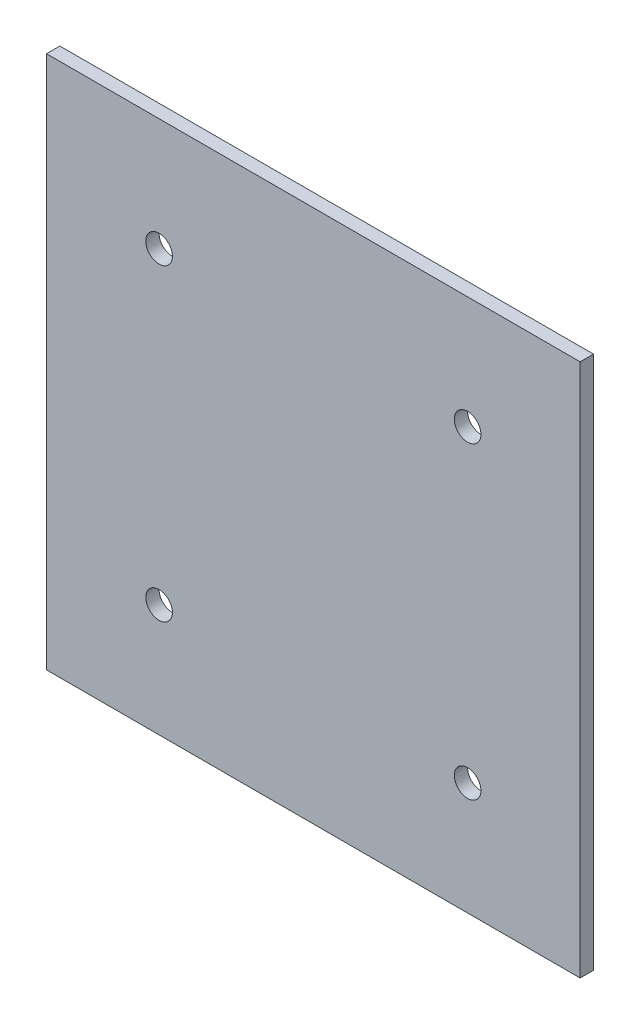
ISO-10303-21;
HEADER;
FILE_DESCRIPTION(('STEP AP214'),'2;1');
FILE_NAME('part.step','',(''),(''),'','','');
FILE_SCHEMA(('AUTOMOTIVE_DESIGN { 1 0 10303 214 1 1 1 1 }'));
ENDSEC;
DATA;
#1=APPLICATION_CONTEXT('core data for automotive mechanical design processes');
#2=APPLICATION_PROTOCOL_DEFINITION('international standard','automotive_design',2000,#1);
#3=PRODUCT_CONTEXT('',#1,'mechanical');
#4=PRODUCT('Part','Part','',(#3));
#5=PRODUCT_RELATED_PRODUCT_CATEGORY('part','',(#4));
#6=PRODUCT_DEFINITION_FORMATION('','',#4);
#7=PRODUCT_DEFINITION_CONTEXT('part definition',#1,'design');
#8=PRODUCT_DEFINITION('design','',#6,#7);
#9=PRODUCT_DEFINITION_SHAPE('','',#8);
#10=(LENGTH_UNIT() NAMED_UNIT(*) SI_UNIT(.MILLI.,.METRE.));
#11=(NAMED_UNIT(*) PLANE_ANGLE_UNIT() SI_UNIT($,.RADIAN.));
#12=(NAMED_UNIT(*) SI_UNIT($,.STERADIAN.) SOLID_ANGLE_UNIT());
#13=UNCERTAINTY_MEASURE_WITH_UNIT(LENGTH_MEASURE(1.E-05),#10,'distance_accuracy_value','');
#14=(GEOMETRIC_REPRESENTATION_CONTEXT(3) GLOBAL_UNCERTAINTY_ASSIGNED_CONTEXT((#13)) GLOBAL_UNIT_ASSIGNED_CONTEXT((#10,
#11,#12)) REPRESENTATION_CONTEXT('',''));
#15=CARTESIAN_POINT('',(0.,0.,0.));
#16=DIRECTION('',(0.,0.,1.));
#17=DIRECTION('',(1.,0.,0.));
#18=AXIS2_PLACEMENT_3D('',#15,#16,#17);
#19=CARTESIAN_POINT('',(32.,-32.,9.6));
#20=DIRECTION('',(-1.,0.,0.));
#21=DIRECTION('',(0.,0.,1.));
#22=AXIS2_PLACEMENT_3D('',#19,#20,#21);
#23=PLANE('',#22);
#24=DIRECTION('',(0.,1.,0.));
#25=VECTOR('',#24,1.);
#26=CARTESIAN_POINT('',(32.,-32.,8.));
#27=LINE('',#26,#25);
#28=CARTESIAN_POINT('',(32.,-32.,8.));
#29=VERTEX_POINT('',#28);
#30=CARTESIAN_POINT('',(32.,32.,8.));
#31=VERTEX_POINT('',#30);
#32=EDGE_CURVE('E98',#29,#31,#27,.T.);
#33=ORIENTED_EDGE('',*,*,#32,.T.);
#34=DIRECTION('',(0.,0.,-1.));
#35=VECTOR('',#34,1.);
#36=CARTESIAN_POINT('',(32.,32.,9.6));
#37=LINE('',#36,#35);
#38=CARTESIAN_POINT('',(32.,32.,9.6));
#39=VERTEX_POINT('',#38);
#40=EDGE_CURVE('E11',#39,#31,#37,.T.);
#41=ORIENTED_EDGE('',*,*,#40,.F.);
#42=DIRECTION('',(0.,1.,0.));
#43=VECTOR('',#42,1.);
#44=CARTESIAN_POINT('',(32.,-32.,9.6));
#45=LINE('',#44,#43);
#46=CARTESIAN_POINT('',(32.,-32.,9.6));
#47=VERTEX_POINT('',#46);
#48=EDGE_CURVE('E86',#47,#39,#45,.T.);
#49=ORIENTED_EDGE('',*,*,#48,.F.);
#50=DIRECTION('',(0.,0.,-1.));
#51=VECTOR('',#50,1.);
#52=CARTESIAN_POINT('',(32.,-32.,9.6));
#53=LINE('',#52,#51);
#54=EDGE_CURVE('E94',#47,#29,#53,.T.);
#55=ORIENTED_EDGE('',*,*,#54,.T.);
#56=EDGE_LOOP('',(#33,#41,#49,#55));
#57=FACE_BOUND('',#56,.T.);
#58=ADVANCED_FACE('F35',(#57),#23,.F.);
#59=CARTESIAN_POINT('',(-32.,32.,9.6));
#60=DIRECTION('',(0.,-1.,0.));
#61=DIRECTION('',(0.,0.,-1.));
#62=AXIS2_PLACEMENT_3D('',#59,#60,#61);
#63=PLANE('',#62);
#64=DIRECTION('',(-1.,0.,0.));
#65=VECTOR('',#64,1.);
#66=CARTESIAN_POINT('',(-32.,32.,8.));
#67=LINE('',#66,#65);
#68=CARTESIAN_POINT('',(-32.,32.,8.));
#69=VERTEX_POINT('',#68);
#70=EDGE_CURVE('E90',#31,#69,#67,.T.);
#71=ORIENTED_EDGE('',*,*,#70,.T.);
#72=DIRECTION('',(0.,0.,-1.));
#73=VECTOR('',#72,1.);
#74=CARTESIAN_POINT('',(-32.,32.,9.6));
#75=LINE('',#74,#73);
#76=CARTESIAN_POINT('',(-32.,32.,9.6));
#77=VERTEX_POINT('',#76);
#78=EDGE_CURVE('E43',#77,#69,#75,.T.);
#79=ORIENTED_EDGE('',*,*,#78,.F.);
#80=DIRECTION('',(-1.,0.,0.));
#81=VECTOR('',#80,1.);
#82=CARTESIAN_POINT('',(-32.,32.,9.6));
#83=LINE('',#82,#81);
#84=EDGE_CURVE('E81',#39,#77,#83,.T.);
#85=ORIENTED_EDGE('',*,*,#84,.F.);
#86=ORIENTED_EDGE('',*,*,#40,.T.);
#87=EDGE_LOOP('',(#71,#79,#85,#86));
#88=FACE_BOUND('',#87,.T.);
#89=ADVANCED_FACE('F89',(#88),#63,.F.);
#90=CARTESIAN_POINT('',(-32.,-32.,9.6));
#91=DIRECTION('',(1.,0.,0.));
#92=DIRECTION('',(0.,0.,-1.));
#93=AXIS2_PLACEMENT_3D('',#90,#91,#92);
#94=PLANE('',#93);
#95=DIRECTION('',(0.,-1.,0.));
#96=VECTOR('',#95,1.);
#97=CARTESIAN_POINT('',(-32.,-32.,8.));
#98=LINE('',#97,#96);
#99=CARTESIAN_POINT('',(-32.,-32.,8.));
#100=VERTEX_POINT('',#99);
#101=EDGE_CURVE('E68',#69,#100,#98,.T.);
#102=ORIENTED_EDGE('',*,*,#101,.T.);
#103=DIRECTION('',(0.,0.,-1.));
#104=VECTOR('',#103,1.);
#105=CARTESIAN_POINT('',(-32.,-32.,9.6));
#106=LINE('',#105,#104);
#107=CARTESIAN_POINT('',(-32.,-32.,9.6));
#108=VERTEX_POINT('',#107);
#109=EDGE_CURVE('E91',#108,#100,#106,.T.);
#110=ORIENTED_EDGE('',*,*,#109,.F.);
#111=DIRECTION('',(0.,-1.,0.));
#112=VECTOR('',#111,1.);
#113=CARTESIAN_POINT('',(-32.,-32.,9.6));
#114=LINE('',#113,#112);
#115=EDGE_CURVE('E84',#77,#108,#114,.T.);
#116=ORIENTED_EDGE('',*,*,#115,.F.);
#117=ORIENTED_EDGE('',*,*,#78,.T.);
#118=EDGE_LOOP('',(#102,#110,#116,#117));
#119=FACE_BOUND('',#118,.T.);
#120=ADVANCED_FACE('F92',(#119),#94,.F.);
#121=CARTESIAN_POINT('',(-32.,-32.,9.6));
#122=DIRECTION('',(0.,1.,0.));
#123=DIRECTION('',(0.,0.,1.));
#124=AXIS2_PLACEMENT_3D('',#121,#122,#123);
#125=PLANE('',#124);
#126=DIRECTION('',(1.,0.,0.));
#127=VECTOR('',#126,1.);
#128=CARTESIAN_POINT('',(-32.,-32.,8.));
#129=LINE('',#128,#127);
#130=EDGE_CURVE('E74',#100,#29,#129,.T.);
#131=ORIENTED_EDGE('',*,*,#130,.T.);
#132=ORIENTED_EDGE('',*,*,#54,.F.);
#133=DIRECTION('',(1.,0.,0.));
#134=VECTOR('',#133,1.);
#135=CARTESIAN_POINT('',(-32.,-32.,9.6));
#136=LINE('',#135,#134);
#137=EDGE_CURVE('E51',#108,#47,#136,.T.);
#138=ORIENTED_EDGE('',*,*,#137,.F.);
#139=ORIENTED_EDGE('',*,*,#109,.T.);
#140=EDGE_LOOP('',(#131,#132,#138,#139));
#141=FACE_BOUND('',#140,.T.);
#142=ADVANCED_FACE('F106',(#141),#125,.F.);
#143=CARTESIAN_POINT('',(0.,0.,9.6));
#144=DIRECTION('',(0.,0.,-1.));
#145=DIRECTION('',(-1.,0.,0.));
#146=AXIS2_PLACEMENT_3D('',#143,#144,#145);
#147=PLANE('',#146);
#148=CARTESIAN_POINT('',(-18.5,18.5,9.6));
#149=DIRECTION('',(0.,0.,1.));
#150=DIRECTION('',(1.,0.,0.));
#151=AXIS2_PLACEMENT_3D('',#148,#149,#150);
#152=CIRCLE('',#151,1.6);
#153=CARTESIAN_POINT('',(-16.9,18.5,9.6));
#154=VERTEX_POINT('',#153);
#155=EDGE_CURVE('E115',#154,#154,#152,.T.);
#156=ORIENTED_EDGE('',*,*,#155,.F.);
#157=EDGE_LOOP('',(#156));
#158=FACE_BOUND('',#157,.T.);
#159=CARTESIAN_POINT('',(18.5,-18.5,9.6));
#160=DIRECTION('',(0.,0.,1.));
#161=DIRECTION('',(1.,0.,0.));
#162=AXIS2_PLACEMENT_3D('',#159,#160,#161);
#163=CIRCLE('',#162,1.6);
#164=CARTESIAN_POINT('',(20.1,-18.5,9.6));
#165=VERTEX_POINT('',#164);
#166=EDGE_CURVE('E121',#165,#165,#163,.T.);
#167=ORIENTED_EDGE('',*,*,#166,.F.);
#168=EDGE_LOOP('',(#167));
#169=FACE_BOUND('',#168,.T.);
#170=CARTESIAN_POINT('',(18.5,18.5,9.6));
#171=DIRECTION('',(0.,0.,1.));
#172=DIRECTION('',(1.,0.,0.));
#173=AXIS2_PLACEMENT_3D('',#170,#171,#172);
#174=CIRCLE('',#173,1.6);
#175=CARTESIAN_POINT('',(20.1,18.5,9.6));
#176=VERTEX_POINT('',#175);
#177=EDGE_CURVE('E122',#176,#176,#174,.T.);
#178=ORIENTED_EDGE('',*,*,#177,.F.);
#179=EDGE_LOOP('',(#178));
#180=FACE_BOUND('',#179,.T.);
#181=CARTESIAN_POINT('',(-18.5,-18.5,9.6));
#182=DIRECTION('',(0.,0.,1.));
#183=DIRECTION('',(1.,0.,0.));
#184=AXIS2_PLACEMENT_3D('',#181,#182,#183);
#185=CIRCLE('',#184,1.6);
#186=CARTESIAN_POINT('',(-16.9,-18.5,9.6));
#187=VERTEX_POINT('',#186);
#188=EDGE_CURVE('E101',#187,#187,#185,.T.);
#189=ORIENTED_EDGE('',*,*,#188,.F.);
#190=EDGE_LOOP('',(#189));
#191=FACE_BOUND('',#190,.T.);
#192=ORIENTED_EDGE('',*,*,#48,.T.);
#193=ORIENTED_EDGE('',*,*,#84,.T.);
#194=ORIENTED_EDGE('',*,*,#115,.T.);
#195=ORIENTED_EDGE('',*,*,#137,.T.);
#196=EDGE_LOOP('',(#192,#193,#194,#195));
#197=FACE_BOUND('',#196,.T.);
#198=ADVANCED_FACE('F82',(#158,#169,#180,#191,#197),#147,.F.);
#199=CARTESIAN_POINT('',(0.,0.,8.));
#200=DIRECTION('',(0.,0.,-1.));
#201=DIRECTION('',(-1.,0.,0.));
#202=AXIS2_PLACEMENT_3D('',#199,#200,#201);
#203=PLANE('',#202);
#204=CARTESIAN_POINT('',(-18.5,18.5,8.));
#205=DIRECTION('',(0.,0.,1.));
#206=DIRECTION('',(1.,0.,0.));
#207=AXIS2_PLACEMENT_3D('',#204,#205,#206);
#208=CIRCLE('',#207,1.6);
#209=CARTESIAN_POINT('',(-16.9,18.5,8.));
#210=VERTEX_POINT('',#209);
#211=EDGE_CURVE('E125',#210,#210,#208,.T.);
#212=ORIENTED_EDGE('',*,*,#211,.T.);
#213=EDGE_LOOP('',(#212));
#214=FACE_BOUND('',#213,.T.);
#215=CARTESIAN_POINT('',(18.5,-18.5,8.));
#216=DIRECTION('',(0.,0.,1.));
#217=DIRECTION('',(1.,0.,0.));
#218=AXIS2_PLACEMENT_3D('',#215,#216,#217);
#219=CIRCLE('',#218,1.6);
#220=CARTESIAN_POINT('',(20.1,-18.5,8.));
#221=VERTEX_POINT('',#220);
#222=EDGE_CURVE('E118',#221,#221,#219,.T.);
#223=ORIENTED_EDGE('',*,*,#222,.T.);
#224=EDGE_LOOP('',(#223));
#225=FACE_BOUND('',#224,.T.);
#226=CARTESIAN_POINT('',(18.5,18.5,8.));
#227=DIRECTION('',(0.,0.,1.));
#228=DIRECTION('',(1.,0.,0.));
#229=AXIS2_PLACEMENT_3D('',#226,#227,#228);
#230=CIRCLE('',#229,1.6);
#231=CARTESIAN_POINT('',(20.1,18.5,8.));
#232=VERTEX_POINT('',#231);
#233=EDGE_CURVE('E130',#232,#232,#230,.T.);
#234=ORIENTED_EDGE('',*,*,#233,.T.);
#235=EDGE_LOOP('',(#234));
#236=FACE_BOUND('',#235,.T.);
#237=CARTESIAN_POINT('',(-18.5,-18.5,8.));
#238=DIRECTION('',(0.,0.,1.));
#239=DIRECTION('',(1.,0.,0.));
#240=AXIS2_PLACEMENT_3D('',#237,#238,#239);
#241=CIRCLE('',#240,1.6);
#242=CARTESIAN_POINT('',(-16.9,-18.5,8.));
#243=VERTEX_POINT('',#242);
#244=EDGE_CURVE('E112',#243,#243,#241,.T.);
#245=ORIENTED_EDGE('',*,*,#244,.T.);
#246=EDGE_LOOP('',(#245));
#247=FACE_BOUND('',#246,.T.);
#248=ORIENTED_EDGE('',*,*,#32,.F.);
#249=ORIENTED_EDGE('',*,*,#130,.F.);
#250=ORIENTED_EDGE('',*,*,#101,.F.);
#251=ORIENTED_EDGE('',*,*,#70,.F.);
#252=EDGE_LOOP('',(#248,#249,#250,#251));
#253=FACE_BOUND('',#252,.T.);
#254=ADVANCED_FACE('F109',(#214,#225,#236,#247,#253),#203,.T.);
#255=CARTESIAN_POINT('',(-18.5,-18.5,9.6));
#256=DIRECTION('',(0.,0.,-1.));
#257=DIRECTION('',(-1.,0.,0.));
#258=AXIS2_PLACEMENT_3D('',#255,#256,#257);
#259=CYLINDRICAL_SURFACE('',#258,1.6);
#260=ORIENTED_EDGE('',*,*,#188,.T.);
#261=EDGE_LOOP('',(#260));
#262=FACE_BOUND('',#261,.T.);
#263=ORIENTED_EDGE('',*,*,#244,.F.);
#264=EDGE_LOOP('',(#263));
#265=FACE_BOUND('',#264,.T.);
#266=ADVANCED_FACE('F145',(#262,#265),#259,.F.);
#267=CARTESIAN_POINT('',(18.5,18.5,9.6));
#268=DIRECTION('',(0.,0.,-1.));
#269=DIRECTION('',(-1.,0.,0.));
#270=AXIS2_PLACEMENT_3D('',#267,#268,#269);
#271=CYLINDRICAL_SURFACE('',#270,1.6);
#272=ORIENTED_EDGE('',*,*,#177,.T.);
#273=EDGE_LOOP('',(#272));
#274=FACE_BOUND('',#273,.T.);
#275=ORIENTED_EDGE('',*,*,#233,.F.);
#276=EDGE_LOOP('',(#275));
#277=FACE_BOUND('',#276,.T.);
#278=ADVANCED_FACE('F136',(#274,#277),#271,.F.);
#279=CARTESIAN_POINT('',(18.5,-18.5,9.6));
#280=DIRECTION('',(0.,0.,-1.));
#281=DIRECTION('',(-1.,0.,0.));
#282=AXIS2_PLACEMENT_3D('',#279,#280,#281);
#283=CYLINDRICAL_SURFACE('',#282,1.6);
#284=ORIENTED_EDGE('',*,*,#166,.T.);
#285=EDGE_LOOP('',(#284));
#286=FACE_BOUND('',#285,.T.);
#287=ORIENTED_EDGE('',*,*,#222,.F.);
#288=EDGE_LOOP('',(#287));
#289=FACE_BOUND('',#288,.T.);
#290=ADVANCED_FACE('F194',(#286,#289),#283,.F.);
#291=CARTESIAN_POINT('',(-18.5,18.5,9.6));
#292=DIRECTION('',(0.,0.,-1.));
#293=DIRECTION('',(-1.,0.,0.));
#294=AXIS2_PLACEMENT_3D('',#291,#292,#293);
#295=CYLINDRICAL_SURFACE('',#294,1.6);
#296=ORIENTED_EDGE('',*,*,#155,.T.);
#297=EDGE_LOOP('',(#296));
#298=FACE_BOUND('',#297,.T.);
#299=ORIENTED_EDGE('',*,*,#211,.F.);
#300=EDGE_LOOP('',(#299));
#301=FACE_BOUND('',#300,.T.);
#302=ADVANCED_FACE('F203',(#298,#301),#295,.F.);
#303=CLOSED_SHELL('',(#58,#89,#120,#142,#198,#254,#266,#278,#290,#302));
#304=MANIFOLD_SOLID_BREP('B2',#303);
#305=ADVANCED_BREP_SHAPE_REPRESENTATION('',(#18,#304),#14);
#306=SHAPE_DEFINITION_REPRESENTATION(#9,#305);
ENDSEC;
END-ISO-10303-21;
